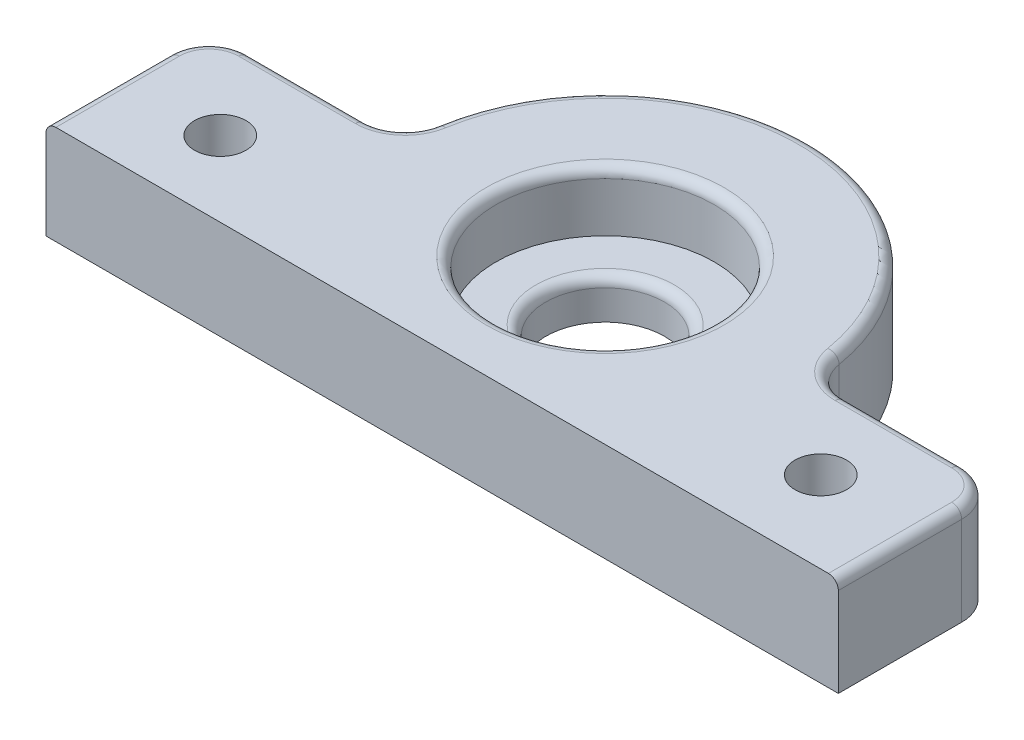
ISO-10303-21;
HEADER;
FILE_DESCRIPTION(('STEP AP214'),'2;1');
FILE_NAME('part.step','',(''),(''),'','','');
FILE_SCHEMA(('AUTOMOTIVE_DESIGN { 1 0 10303 214 1 1 1 1 }'));
ENDSEC;
DATA;
#1=APPLICATION_CONTEXT('core data for automotive mechanical design processes');
#2=APPLICATION_PROTOCOL_DEFINITION('international standard','automotive_design',2000,#1);
#3=PRODUCT_CONTEXT('',#1,'mechanical');
#4=PRODUCT('Part','Part','',(#3));
#5=PRODUCT_RELATED_PRODUCT_CATEGORY('part','',(#4));
#6=PRODUCT_DEFINITION_FORMATION('','',#4);
#7=PRODUCT_DEFINITION_CONTEXT('part definition',#1,'design');
#8=PRODUCT_DEFINITION('design','',#6,#7);
#9=PRODUCT_DEFINITION_SHAPE('','',#8);
#10=(LENGTH_UNIT() NAMED_UNIT(*) SI_UNIT(.MILLI.,.METRE.));
#11=(NAMED_UNIT(*) PLANE_ANGLE_UNIT() SI_UNIT($,.RADIAN.));
#12=(NAMED_UNIT(*) SI_UNIT($,.STERADIAN.) SOLID_ANGLE_UNIT());
#13=UNCERTAINTY_MEASURE_WITH_UNIT(LENGTH_MEASURE(1.E-05),#10,'distance_accuracy_value','');
#14=(GEOMETRIC_REPRESENTATION_CONTEXT(3) GLOBAL_UNCERTAINTY_ASSIGNED_CONTEXT((#13)) GLOBAL_UNIT_ASSIGNED_CONTEXT((#10,
#11,#12)) REPRESENTATION_CONTEXT('',''));
#15=CARTESIAN_POINT('',(0.,0.,0.));
#16=DIRECTION('',(0.,0.,1.));
#17=DIRECTION('',(1.,0.,0.));
#18=AXIS2_PLACEMENT_3D('',#15,#16,#17);
#19=CARTESIAN_POINT('',(0.,10.,0.));
#20=DIRECTION('',(0.,-1.,0.));
#21=DIRECTION('',(0.,0.,-1.));
#22=AXIS2_PLACEMENT_3D('',#19,#20,#21);
#23=CYLINDRICAL_SURFACE('',#22,11.025);
#24=CARTESIAN_POINT('',(0.,9.,0.));
#25=DIRECTION('',(0.,1.,0.));
#26=DIRECTION('',(0.,0.,1.));
#27=AXIS2_PLACEMENT_3D('',#24,#25,#26);
#28=CIRCLE('',#27,11.025);
#29=CARTESIAN_POINT('',(0.,9.,11.025));
#30=VERTEX_POINT('',#29);
#31=EDGE_CURVE('E247',#30,#30,#28,.T.);
#32=ORIENTED_EDGE('',*,*,#31,.T.);
#33=EDGE_LOOP('',(#32));
#34=FACE_BOUND('',#33,.T.);
#35=CARTESIAN_POINT('',(0.,4.,0.));
#36=DIRECTION('',(0.,-1.,0.));
#37=DIRECTION('',(0.,0.,-1.));
#38=AXIS2_PLACEMENT_3D('',#35,#36,#37);
#39=CIRCLE('',#38,11.025);
#40=CARTESIAN_POINT('',(0.,4.,-11.025));
#41=VERTEX_POINT('',#40);
#42=EDGE_CURVE('E160',#41,#41,#39,.T.);
#43=ORIENTED_EDGE('',*,*,#42,.T.);
#44=EDGE_LOOP('',(#43));
#45=FACE_BOUND('',#44,.T.);
#46=ADVANCED_FACE('F34',(#34,#45),#23,.F.);
#47=CARTESIAN_POINT('',(0.,10.,0.));
#48=DIRECTION('',(0.,1.,0.));
#49=DIRECTION('',(0.,0.,1.));
#50=AXIS2_PLACEMENT_3D('',#47,#48,#49);
#51=PLANE('',#50);
#52=CARTESIAN_POINT('',(-29.9966400739153,10.,8.86202444078227));
#53=DIRECTION('',(0.,1.,0.));
#54=DIRECTION('',(0.,0.,1.));
#55=AXIS2_PLACEMENT_3D('',#52,#53,#54);
#56=CIRCLE('',#55,2.6);
#57=CARTESIAN_POINT('',(-29.9966400739153,10.,11.4620244407823));
#58=VERTEX_POINT('',#57);
#59=EDGE_CURVE('E603',#58,#58,#56,.F.);
#60=ORIENTED_EDGE('',*,*,#59,.T.);
#61=EDGE_LOOP('',(#60));
#62=FACE_BOUND('',#61,.T.);
#63=CARTESIAN_POINT('',(30.,10.,8.22706));
#64=DIRECTION('',(0.,1.,0.));
#65=DIRECTION('',(0.,0.,1.));
#66=AXIS2_PLACEMENT_3D('',#63,#64,#65);
#67=CIRCLE('',#66,2.6);
#68=CARTESIAN_POINT('',(30.,10.,10.82706));
#69=VERTEX_POINT('',#68);
#70=EDGE_CURVE('E290',#69,#69,#67,.F.);
#71=ORIENTED_EDGE('',*,*,#70,.T.);
#72=EDGE_LOOP('',(#71));
#73=FACE_BOUND('',#72,.T.);
#74=CARTESIAN_POINT('',(0.,10.,0.));
#75=DIRECTION('',(0.,1.,0.));
#76=DIRECTION('',(0.,0.,1.));
#77=AXIS2_PLACEMENT_3D('',#74,#75,#76);
#78=CIRCLE('',#77,12.025);
#79=CARTESIAN_POINT('',(0.,10.,12.025));
#80=VERTEX_POINT('',#79);
#81=EDGE_CURVE('E226',#80,#80,#78,.F.);
#82=ORIENTED_EDGE('',*,*,#81,.T.);
#83=EDGE_LOOP('',(#82));
#84=FACE_BOUND('',#83,.T.);
#85=DIRECTION('',(1.,0.,0.));
#86=VECTOR('',#85,1.);
#87=CARTESIAN_POINT('',(-40.,10.,16.45412));
#88=LINE('',#87,#86);
#89=CARTESIAN_POINT('',(-39.,10.,16.45412));
#90=VERTEX_POINT('',#89);
#91=CARTESIAN_POINT('',(39.,10.,16.45412));
#92=VERTEX_POINT('',#91);
#93=EDGE_CURVE('E179',#90,#92,#88,.T.);
#94=ORIENTED_EDGE('',*,*,#93,.T.);
#95=DIRECTION('',(0.,0.,-1.));
#96=VECTOR('',#95,1.);
#97=CARTESIAN_POINT('',(39.,10.,4.));
#98=LINE('',#97,#96);
#99=CARTESIAN_POINT('',(39.,10.,4.));
#100=VERTEX_POINT('',#99);
#101=EDGE_CURVE('E223',#92,#100,#98,.T.);
#102=ORIENTED_EDGE('',*,*,#101,.T.);
#103=CARTESIAN_POINT('',(36.,10.,4.));
#104=DIRECTION('',(0.,1.,0.));
#105=DIRECTION('',(0.,0.,1.));
#106=AXIS2_PLACEMENT_3D('',#103,#104,#105);
#107=CIRCLE('',#106,3.);
#108=CARTESIAN_POINT('',(36.,10.,1.));
#109=VERTEX_POINT('',#108);
#110=EDGE_CURVE('E221',#100,#109,#107,.T.);
#111=ORIENTED_EDGE('',*,*,#110,.T.);
#112=DIRECTION('',(-1.,0.,0.));
#113=VECTOR('',#112,1.);
#114=CARTESIAN_POINT('',(24.2219425315147,10.,1.));
#115=LINE('',#114,#113);
#116=CARTESIAN_POINT('',(24.2219425315147,10.,1.));
#117=VERTEX_POINT('',#116);
#118=EDGE_CURVE('E219',#109,#117,#115,.T.);
#119=ORIENTED_EDGE('',*,*,#118,.T.);
#120=CARTESIAN_POINT('',(24.2219425315147,10.,-4.));
#121=DIRECTION('',(0.,1.,0.));
#122=DIRECTION('',(0.,0.,1.));
#123=AXIS2_PLACEMENT_3D('',#120,#121,#122);
#124=CIRCLE('',#123,5.);
#125=CARTESIAN_POINT('',(19.2887566798824,10.,-3.18533604887984));
#126=VERTEX_POINT('',#125);
#127=EDGE_CURVE('E217',#117,#126,#124,.F.);
#128=ORIENTED_EDGE('',*,*,#127,.T.);
#129=CARTESIAN_POINT('',(0.,10.,0.));
#130=DIRECTION('',(0.,1.,0.));
#131=DIRECTION('',(0.,0.,1.));
#132=AXIS2_PLACEMENT_3D('',#129,#130,#131);
#133=CIRCLE('',#132,19.55);
#134=CARTESIAN_POINT('',(-19.2887566798824,10.,-3.18533604887984));
#135=VERTEX_POINT('',#134);
#136=EDGE_CURVE('E215',#126,#135,#133,.T.);
#137=ORIENTED_EDGE('',*,*,#136,.T.);
#138=CARTESIAN_POINT('',(-24.2219425315147,10.,-4.));
#139=DIRECTION('',(0.,1.,0.));
#140=DIRECTION('',(0.,0.,1.));
#141=AXIS2_PLACEMENT_3D('',#138,#139,#140);
#142=CIRCLE('',#141,5.);
#143=CARTESIAN_POINT('',(-24.2219425315147,10.,1.));
#144=VERTEX_POINT('',#143);
#145=EDGE_CURVE('E213',#135,#144,#142,.F.);
#146=ORIENTED_EDGE('',*,*,#145,.T.);
#147=DIRECTION('',(-1.,0.,0.));
#148=VECTOR('',#147,1.);
#149=CARTESIAN_POINT('',(-36.,10.,1.));
#150=LINE('',#149,#148);
#151=CARTESIAN_POINT('',(-36.,10.,1.));
#152=VERTEX_POINT('',#151);
#153=EDGE_CURVE('E211',#144,#152,#150,.T.);
#154=ORIENTED_EDGE('',*,*,#153,.T.);
#155=CARTESIAN_POINT('',(-36.,10.,4.));
#156=DIRECTION('',(0.,1.,0.));
#157=DIRECTION('',(0.,0.,1.));
#158=AXIS2_PLACEMENT_3D('',#155,#156,#157);
#159=CIRCLE('',#158,3.);
#160=CARTESIAN_POINT('',(-39.,10.,4.));
#161=VERTEX_POINT('',#160);
#162=EDGE_CURVE('E209',#152,#161,#159,.T.);
#163=ORIENTED_EDGE('',*,*,#162,.T.);
#164=DIRECTION('',(0.,0.,1.));
#165=VECTOR('',#164,1.);
#166=CARTESIAN_POINT('',(-39.,10.,16.45412));
#167=LINE('',#166,#165);
#168=EDGE_CURVE('E207',#161,#90,#167,.T.);
#169=ORIENTED_EDGE('',*,*,#168,.T.);
#170=EDGE_LOOP('',(#94,#102,#111,#119,#128,#137,#146,#154,#163,#169));
#171=FACE_BOUND('',#170,.T.);
#172=ADVANCED_FACE('F295',(#62,#73,#84,#171),#51,.T.);
#173=CARTESIAN_POINT('',(0.,0.,0.));
#174=DIRECTION('',(0.,1.,0.));
#175=DIRECTION('',(0.,0.,1.));
#176=AXIS2_PLACEMENT_3D('',#173,#174,#175);
#177=PLANE('',#176);
#178=CARTESIAN_POINT('',(-29.9966400739153,0.,8.86202444078227));
#179=DIRECTION('',(0.,-1.,0.));
#180=DIRECTION('',(0.,0.,-1.));
#181=AXIS2_PLACEMENT_3D('',#178,#179,#180);
#182=CIRCLE('',#181,2.6);
#183=CARTESIAN_POINT('',(-29.9966400739153,0.,6.26202444078227));
#184=VERTEX_POINT('',#183);
#185=EDGE_CURVE('E606',#184,#184,#182,.T.);
#186=ORIENTED_EDGE('',*,*,#185,.F.);
#187=EDGE_LOOP('',(#186));
#188=FACE_BOUND('',#187,.T.);
#189=CARTESIAN_POINT('',(30.,0.,8.22706));
#190=DIRECTION('',(0.,-1.,0.));
#191=DIRECTION('',(0.,0.,-1.));
#192=AXIS2_PLACEMENT_3D('',#189,#190,#191);
#193=CIRCLE('',#192,2.6);
#194=CARTESIAN_POINT('',(30.,0.,5.62706));
#195=VERTEX_POINT('',#194);
#196=EDGE_CURVE('E258',#195,#195,#193,.T.);
#197=ORIENTED_EDGE('',*,*,#196,.F.);
#198=EDGE_LOOP('',(#197));
#199=FACE_BOUND('',#198,.T.);
#200=DIRECTION('',(0.,0.,1.));
#201=VECTOR('',#200,1.);
#202=CARTESIAN_POINT('',(-40.,0.,16.45412));
#203=LINE('',#202,#201);
#204=CARTESIAN_POINT('',(-40.,0.,4.));
#205=VERTEX_POINT('',#204);
#206=CARTESIAN_POINT('',(-40.,0.,16.45412));
#207=VERTEX_POINT('',#206);
#208=EDGE_CURVE('E156',#205,#207,#203,.T.);
#209=ORIENTED_EDGE('',*,*,#208,.F.);
#210=CARTESIAN_POINT('',(-36.,0.,4.));
#211=DIRECTION('',(0.,1.,0.));
#212=DIRECTION('',(0.,0.,1.));
#213=AXIS2_PLACEMENT_3D('',#210,#211,#212);
#214=CIRCLE('',#213,4.);
#215=CARTESIAN_POINT('',(-36.,0.,0.));
#216=VERTEX_POINT('',#215);
#217=EDGE_CURVE('E184',#205,#216,#214,.F.);
#218=ORIENTED_EDGE('',*,*,#217,.T.);
#219=DIRECTION('',(-1.,0.,0.));
#220=VECTOR('',#219,1.);
#221=CARTESIAN_POINT('',(-40.,0.,0.));
#222=LINE('',#221,#220);
#223=CARTESIAN_POINT('',(-24.2219425315147,0.,0.));
#224=VERTEX_POINT('',#223);
#225=EDGE_CURVE('E176',#224,#216,#222,.T.);
#226=ORIENTED_EDGE('',*,*,#225,.F.);
#227=CARTESIAN_POINT('',(-24.2219425315147,0.,-4.));
#228=DIRECTION('',(0.,1.,0.));
#229=DIRECTION('',(0.,0.,1.));
#230=AXIS2_PLACEMENT_3D('',#227,#228,#229);
#231=CIRCLE('',#230,4.);
#232=CARTESIAN_POINT('',(-20.2753938502088,0.,-3.34826883910387));
#233=VERTEX_POINT('',#232);
#234=EDGE_CURVE('E203',#224,#233,#231,.T.);
#235=ORIENTED_EDGE('',*,*,#234,.T.);
#236=CARTESIAN_POINT('',(0.,0.,0.));
#237=DIRECTION('',(0.,1.,0.));
#238=DIRECTION('',(0.,0.,1.));
#239=AXIS2_PLACEMENT_3D('',#236,#237,#238);
#240=CIRCLE('',#239,20.55);
#241=CARTESIAN_POINT('',(20.2753938502088,0.,-3.34826883910387));
#242=VERTEX_POINT('',#241);
#243=EDGE_CURVE('E173',#242,#233,#240,.T.);
#244=ORIENTED_EDGE('',*,*,#243,.F.);
#245=CARTESIAN_POINT('',(24.2219425315147,0.,-4.));
#246=DIRECTION('',(0.,1.,0.));
#247=DIRECTION('',(0.,0.,1.));
#248=AXIS2_PLACEMENT_3D('',#245,#246,#247);
#249=CIRCLE('',#248,4.);
#250=CARTESIAN_POINT('',(24.2219425315147,0.,0.));
#251=VERTEX_POINT('',#250);
#252=EDGE_CURVE('E205',#242,#251,#249,.T.);
#253=ORIENTED_EDGE('',*,*,#252,.T.);
#254=DIRECTION('',(-1.,0.,0.));
#255=VECTOR('',#254,1.);
#256=CARTESIAN_POINT('',(40.,0.,0.));
#257=LINE('',#256,#255);
#258=CARTESIAN_POINT('',(36.,0.,0.));
#259=VERTEX_POINT('',#258);
#260=EDGE_CURVE('E167',#259,#251,#257,.T.);
#261=ORIENTED_EDGE('',*,*,#260,.F.);
#262=CARTESIAN_POINT('',(36.,0.,4.));
#263=DIRECTION('',(0.,1.,0.));
#264=DIRECTION('',(0.,0.,1.));
#265=AXIS2_PLACEMENT_3D('',#262,#263,#264);
#266=CIRCLE('',#265,4.);
#267=CARTESIAN_POINT('',(40.,0.,4.));
#268=VERTEX_POINT('',#267);
#269=EDGE_CURVE('E182',#259,#268,#266,.F.);
#270=ORIENTED_EDGE('',*,*,#269,.T.);
#271=DIRECTION('',(0.,0.,-1.));
#272=VECTOR('',#271,1.);
#273=CARTESIAN_POINT('',(40.,0.,16.45412));
#274=LINE('',#273,#272);
#275=CARTESIAN_POINT('',(40.,0.,16.45412));
#276=VERTEX_POINT('',#275);
#277=EDGE_CURVE('E165',#276,#268,#274,.T.);
#278=ORIENTED_EDGE('',*,*,#277,.F.);
#279=DIRECTION('',(1.,0.,0.));
#280=VECTOR('',#279,1.);
#281=CARTESIAN_POINT('',(-40.,0.,16.45412));
#282=LINE('',#281,#280);
#283=EDGE_CURVE('E147',#207,#276,#282,.T.);
#284=ORIENTED_EDGE('',*,*,#283,.F.);
#285=EDGE_LOOP('',(#209,#218,#226,#235,#244,#253,#261,#270,#278,#284));
#286=FACE_BOUND('',#285,.T.);
#287=CARTESIAN_POINT('',(0.,0.,0.));
#288=DIRECTION('',(0.,-1.,0.));
#289=DIRECTION('',(0.,0.,-1.));
#290=AXIS2_PLACEMENT_3D('',#287,#288,#289);
#291=CIRCLE('',#290,6.);
#292=CARTESIAN_POINT('',(0.,0.,-6.));
#293=VERTEX_POINT('',#292);
#294=EDGE_CURVE('E279',#293,#293,#291,.T.);
#295=ORIENTED_EDGE('',*,*,#294,.F.);
#296=EDGE_LOOP('',(#295));
#297=FACE_BOUND('',#296,.T.);
#298=ADVANCED_FACE('F162',(#188,#199,#286,#297),#177,.F.);
#299=CARTESIAN_POINT('',(-40.,10.,16.45412));
#300=DIRECTION('',(1.,0.,0.));
#301=DIRECTION('',(0.,0.,-1.));
#302=AXIS2_PLACEMENT_3D('',#299,#300,#301);
#303=PLANE('',#302);
#304=DIRECTION('',(0.,-1.,0.));
#305=VECTOR('',#304,1.);
#306=CARTESIAN_POINT('',(-40.,10.,16.45412));
#307=LINE('',#306,#305);
#308=CARTESIAN_POINT('',(-40.,9.,16.45412));
#309=VERTEX_POINT('',#308);
#310=EDGE_CURVE('E142',#309,#207,#307,.T.);
#311=ORIENTED_EDGE('',*,*,#310,.F.);
#312=DIRECTION('',(0.,0.,1.));
#313=VECTOR('',#312,1.);
#314=CARTESIAN_POINT('',(-40.,9.,4.));
#315=LINE('',#314,#313);
#316=CARTESIAN_POINT('',(-40.,9.,4.));
#317=VERTEX_POINT('',#316);
#318=EDGE_CURVE('E11',#309,#317,#315,.F.);
#319=ORIENTED_EDGE('',*,*,#318,.T.);
#320=DIRECTION('',(0.,-1.,0.));
#321=VECTOR('',#320,1.);
#322=CARTESIAN_POINT('',(-40.,10.,4.));
#323=LINE('',#322,#321);
#324=EDGE_CURVE('E152',#317,#205,#323,.T.);
#325=ORIENTED_EDGE('',*,*,#324,.T.);
#326=ORIENTED_EDGE('',*,*,#208,.T.);
#327=EDGE_LOOP('',(#311,#319,#325,#326));
#328=FACE_BOUND('',#327,.T.);
#329=ADVANCED_FACE('F157',(#328),#303,.F.);
#330=CARTESIAN_POINT('',(-40.,10.,16.45412));
#331=DIRECTION('',(0.,0.,-1.));
#332=DIRECTION('',(-1.,0.,0.));
#333=AXIS2_PLACEMENT_3D('',#330,#331,#332);
#334=PLANE('',#333);
#335=DIRECTION('',(0.,-1.,0.));
#336=VECTOR('',#335,1.);
#337=CARTESIAN_POINT('',(40.,10.,16.45412));
#338=LINE('',#337,#336);
#339=CARTESIAN_POINT('',(40.,9.,16.45412));
#340=VERTEX_POINT('',#339);
#341=EDGE_CURVE('E153',#340,#276,#338,.T.);
#342=ORIENTED_EDGE('',*,*,#341,.F.);
#343=CARTESIAN_POINT('',(39.,9.,16.45412));
#344=DIRECTION('',(0.,0.,-1.));
#345=DIRECTION('',(-1.,0.,0.));
#346=AXIS2_PLACEMENT_3D('',#343,#344,#345);
#347=CIRCLE('',#346,1.);
#348=EDGE_CURVE('E232',#340,#92,#347,.F.);
#349=ORIENTED_EDGE('',*,*,#348,.T.);
#350=ORIENTED_EDGE('',*,*,#93,.F.);
#351=CARTESIAN_POINT('',(-39.,9.,16.45412));
#352=DIRECTION('',(0.,0.,-1.));
#353=DIRECTION('',(-1.,0.,0.));
#354=AXIS2_PLACEMENT_3D('',#351,#352,#353);
#355=CIRCLE('',#354,1.);
#356=EDGE_CURVE('E151',#90,#309,#355,.F.);
#357=ORIENTED_EDGE('',*,*,#356,.T.);
#358=ORIENTED_EDGE('',*,*,#310,.T.);
#359=ORIENTED_EDGE('',*,*,#283,.T.);
#360=EDGE_LOOP('',(#342,#349,#350,#357,#358,#359));
#361=FACE_BOUND('',#360,.T.);
#362=ADVANCED_FACE('F145',(#361),#334,.F.);
#363=CARTESIAN_POINT('',(40.,10.,16.45412));
#364=DIRECTION('',(-1.,0.,0.));
#365=DIRECTION('',(0.,0.,1.));
#366=AXIS2_PLACEMENT_3D('',#363,#364,#365);
#367=PLANE('',#366);
#368=DIRECTION('',(0.,-1.,0.));
#369=VECTOR('',#368,1.);
#370=CARTESIAN_POINT('',(40.,10.,4.));
#371=LINE('',#370,#369);
#372=CARTESIAN_POINT('',(40.,9.,4.));
#373=VERTEX_POINT('',#372);
#374=EDGE_CURVE('E200',#268,#373,#371,.F.);
#375=ORIENTED_EDGE('',*,*,#374,.T.);
#376=DIRECTION('',(0.,0.,-1.));
#377=VECTOR('',#376,1.);
#378=CARTESIAN_POINT('',(40.,9.,16.45412));
#379=LINE('',#378,#377);
#380=EDGE_CURVE('E229',#373,#340,#379,.F.);
#381=ORIENTED_EDGE('',*,*,#380,.T.);
#382=ORIENTED_EDGE('',*,*,#341,.T.);
#383=ORIENTED_EDGE('',*,*,#277,.T.);
#384=EDGE_LOOP('',(#375,#381,#382,#383));
#385=FACE_BOUND('',#384,.T.);
#386=ADVANCED_FACE('F375',(#385),#367,.F.);
#387=CARTESIAN_POINT('',(40.,10.,0.));
#388=DIRECTION('',(0.,0.,1.));
#389=DIRECTION('',(1.,0.,0.));
#390=AXIS2_PLACEMENT_3D('',#387,#388,#389);
#391=PLANE('',#390);
#392=DIRECTION('',(0.,1.,0.));
#393=VECTOR('',#392,1.);
#394=CARTESIAN_POINT('',(24.2219425315147,10.,0.));
#395=LINE('',#394,#393);
#396=CARTESIAN_POINT('',(24.2219425315147,9.,0.));
#397=VERTEX_POINT('',#396);
#398=EDGE_CURVE('E197',#251,#397,#395,.T.);
#399=ORIENTED_EDGE('',*,*,#398,.T.);
#400=DIRECTION('',(-1.,0.,0.));
#401=VECTOR('',#400,1.);
#402=CARTESIAN_POINT('',(36.,9.,0.));
#403=LINE('',#402,#401);
#404=CARTESIAN_POINT('',(36.,9.,0.));
#405=VERTEX_POINT('',#404);
#406=EDGE_CURVE('E236',#397,#405,#403,.F.);
#407=ORIENTED_EDGE('',*,*,#406,.T.);
#408=DIRECTION('',(0.,-1.,0.));
#409=VECTOR('',#408,1.);
#410=CARTESIAN_POINT('',(36.,10.,0.));
#411=LINE('',#410,#409);
#412=EDGE_CURVE('E195',#405,#259,#411,.T.);
#413=ORIENTED_EDGE('',*,*,#412,.T.);
#414=ORIENTED_EDGE('',*,*,#260,.T.);
#415=EDGE_LOOP('',(#399,#407,#413,#414));
#416=FACE_BOUND('',#415,.T.);
#417=ADVANCED_FACE('F371',(#416),#391,.F.);
#418=CARTESIAN_POINT('',(0.,10.,0.));
#419=DIRECTION('',(0.,-1.,0.));
#420=DIRECTION('',(0.,0.,-1.));
#421=AXIS2_PLACEMENT_3D('',#418,#419,#420);
#422=CYLINDRICAL_SURFACE('',#421,20.55);
#423=DIRECTION('',(0.,-1.,0.));
#424=VECTOR('',#423,1.);
#425=CARTESIAN_POINT('',(-20.2753938502088,10.,-3.34826883910387));
#426=LINE('',#425,#424);
#427=CARTESIAN_POINT('',(-20.2753938502088,9.,-3.34826883910387));
#428=VERTEX_POINT('',#427);
#429=EDGE_CURVE('E192',#233,#428,#426,.F.);
#430=ORIENTED_EDGE('',*,*,#429,.T.);
#431=CARTESIAN_POINT('',(0.,9.,0.));
#432=DIRECTION('',(0.,1.,0.));
#433=DIRECTION('',(0.,0.,1.));
#434=AXIS2_PLACEMENT_3D('',#431,#432,#433);
#435=CIRCLE('',#434,20.55);
#436=CARTESIAN_POINT('',(20.2753938502088,9.,-3.34826883910387));
#437=VERTEX_POINT('',#436);
#438=EDGE_CURVE('E240',#428,#437,#435,.F.);
#439=ORIENTED_EDGE('',*,*,#438,.T.);
#440=DIRECTION('',(0.,-1.,0.));
#441=VECTOR('',#440,1.);
#442=CARTESIAN_POINT('',(20.2753938502088,10.,-3.34826883910387));
#443=LINE('',#442,#441);
#444=EDGE_CURVE('E190',#437,#242,#443,.T.);
#445=ORIENTED_EDGE('',*,*,#444,.T.);
#446=ORIENTED_EDGE('',*,*,#243,.T.);
#447=EDGE_LOOP('',(#430,#439,#445,#446));
#448=FACE_BOUND('',#447,.T.);
#449=ADVANCED_FACE('F368',(#448),#422,.T.);
#450=CARTESIAN_POINT('',(-40.,10.,0.));
#451=DIRECTION('',(0.,0.,1.));
#452=DIRECTION('',(1.,0.,0.));
#453=AXIS2_PLACEMENT_3D('',#450,#451,#452);
#454=PLANE('',#453);
#455=DIRECTION('',(0.,-1.,0.));
#456=VECTOR('',#455,1.);
#457=CARTESIAN_POINT('',(-36.,10.,0.));
#458=LINE('',#457,#456);
#459=CARTESIAN_POINT('',(-36.,9.,0.));
#460=VERTEX_POINT('',#459);
#461=EDGE_CURVE('E188',#216,#460,#458,.F.);
#462=ORIENTED_EDGE('',*,*,#461,.T.);
#463=DIRECTION('',(-1.,0.,0.));
#464=VECTOR('',#463,1.);
#465=CARTESIAN_POINT('',(-24.2219425315147,9.,0.));
#466=LINE('',#465,#464);
#467=CARTESIAN_POINT('',(-24.2219425315147,9.,0.));
#468=VERTEX_POINT('',#467);
#469=EDGE_CURVE('E244',#460,#468,#466,.F.);
#470=ORIENTED_EDGE('',*,*,#469,.T.);
#471=DIRECTION('',(0.,1.,0.));
#472=VECTOR('',#471,1.);
#473=CARTESIAN_POINT('',(-24.2219425315147,0.,0.));
#474=LINE('',#473,#472);
#475=EDGE_CURVE('E186',#468,#224,#474,.F.);
#476=ORIENTED_EDGE('',*,*,#475,.T.);
#477=ORIENTED_EDGE('',*,*,#225,.T.);
#478=EDGE_LOOP('',(#462,#470,#476,#477));
#479=FACE_BOUND('',#478,.T.);
#480=ADVANCED_FACE('F330',(#479),#454,.F.);
#481=CARTESIAN_POINT('',(0.,4.,0.));
#482=DIRECTION('',(0.,-1.,0.));
#483=DIRECTION('',(0.,0.,-1.));
#484=AXIS2_PLACEMENT_3D('',#481,#482,#483);
#485=PLANE('',#484);
#486=CARTESIAN_POINT('',(0.,4.,0.));
#487=DIRECTION('',(0.,-1.,0.));
#488=DIRECTION('',(0.,0.,-1.));
#489=AXIS2_PLACEMENT_3D('',#486,#487,#488);
#490=CIRCLE('',#489,7.);
#491=CARTESIAN_POINT('',(0.,4.,-7.));
#492=VERTEX_POINT('',#491);
#493=EDGE_CURVE('E250',#492,#492,#490,.T.);
#494=ORIENTED_EDGE('',*,*,#493,.T.);
#495=EDGE_LOOP('',(#494));
#496=FACE_BOUND('',#495,.T.);
#497=ORIENTED_EDGE('',*,*,#42,.F.);
#498=EDGE_LOOP('',(#497));
#499=FACE_BOUND('',#498,.T.);
#500=ADVANCED_FACE('F360',(#496,#499),#485,.F.);
#501=CARTESIAN_POINT('',(0.,4.,0.));
#502=DIRECTION('',(0.,-1.,0.));
#503=DIRECTION('',(0.,0.,-1.));
#504=AXIS2_PLACEMENT_3D('',#501,#502,#503);
#505=CYLINDRICAL_SURFACE('',#504,6.);
#506=CARTESIAN_POINT('',(0.,3.,0.));
#507=DIRECTION('',(0.,-1.,0.));
#508=DIRECTION('',(0.,0.,-1.));
#509=AXIS2_PLACEMENT_3D('',#506,#507,#508);
#510=CIRCLE('',#509,6.);
#511=CARTESIAN_POINT('',(0.,3.,-6.));
#512=VERTEX_POINT('',#511);
#513=EDGE_CURVE('E43',#512,#512,#510,.F.);
#514=ORIENTED_EDGE('',*,*,#513,.T.);
#515=EDGE_LOOP('',(#514));
#516=FACE_BOUND('',#515,.T.);
#517=ORIENTED_EDGE('',*,*,#294,.T.);
#518=EDGE_LOOP('',(#517));
#519=FACE_BOUND('',#518,.T.);
#520=ADVANCED_FACE('F386',(#516,#519),#505,.F.);
#521=CARTESIAN_POINT('',(-36.,10.,4.));
#522=DIRECTION('',(0.,-1.,0.));
#523=DIRECTION('',(0.,0.,-1.));
#524=AXIS2_PLACEMENT_3D('',#521,#522,#523);
#525=CYLINDRICAL_SURFACE('',#524,4.);
#526=ORIENTED_EDGE('',*,*,#324,.F.);
#527=CARTESIAN_POINT('',(-36.,9.,4.));
#528=DIRECTION('',(0.,1.,0.));
#529=DIRECTION('',(0.,0.,1.));
#530=AXIS2_PLACEMENT_3D('',#527,#528,#529);
#531=CIRCLE('',#530,4.);
#532=EDGE_CURVE('E56',#317,#460,#531,.F.);
#533=ORIENTED_EDGE('',*,*,#532,.T.);
#534=ORIENTED_EDGE('',*,*,#461,.F.);
#535=ORIENTED_EDGE('',*,*,#217,.F.);
#536=EDGE_LOOP('',(#526,#533,#534,#535));
#537=FACE_BOUND('',#536,.T.);
#538=ADVANCED_FACE('F337',(#537),#525,.T.);
#539=CARTESIAN_POINT('',(-24.2219425315147,10.,-4.));
#540=DIRECTION('',(0.,-1.,0.));
#541=DIRECTION('',(0.,0.,-1.));
#542=AXIS2_PLACEMENT_3D('',#539,#540,#541);
#543=CYLINDRICAL_SURFACE('',#542,4.);
#544=ORIENTED_EDGE('',*,*,#475,.F.);
#545=CARTESIAN_POINT('',(-24.2219425315147,9.,-4.));
#546=DIRECTION('',(0.,1.,0.));
#547=DIRECTION('',(0.,0.,1.));
#548=AXIS2_PLACEMENT_3D('',#545,#546,#547);
#549=CIRCLE('',#548,4.);
#550=EDGE_CURVE('E242',#468,#428,#549,.T.);
#551=ORIENTED_EDGE('',*,*,#550,.T.);
#552=ORIENTED_EDGE('',*,*,#429,.F.);
#553=ORIENTED_EDGE('',*,*,#234,.F.);
#554=EDGE_LOOP('',(#544,#551,#552,#553));
#555=FACE_BOUND('',#554,.T.);
#556=ADVANCED_FACE('F333',(#555),#543,.F.);
#557=CARTESIAN_POINT('',(24.2219425315147,10.,-4.));
#558=DIRECTION('',(0.,-1.,0.));
#559=DIRECTION('',(0.,0.,-1.));
#560=AXIS2_PLACEMENT_3D('',#557,#558,#559);
#561=CYLINDRICAL_SURFACE('',#560,4.);
#562=ORIENTED_EDGE('',*,*,#444,.F.);
#563=CARTESIAN_POINT('',(24.2219425315147,9.,-4.));
#564=DIRECTION('',(0.,1.,0.));
#565=DIRECTION('',(0.,0.,1.));
#566=AXIS2_PLACEMENT_3D('',#563,#564,#565);
#567=CIRCLE('',#566,4.);
#568=EDGE_CURVE('E238',#437,#397,#567,.T.);
#569=ORIENTED_EDGE('',*,*,#568,.T.);
#570=ORIENTED_EDGE('',*,*,#398,.F.);
#571=ORIENTED_EDGE('',*,*,#252,.F.);
#572=EDGE_LOOP('',(#562,#569,#570,#571));
#573=FACE_BOUND('',#572,.T.);
#574=ADVANCED_FACE('F389',(#573),#561,.F.);
#575=CARTESIAN_POINT('',(36.,10.,4.));
#576=DIRECTION('',(0.,-1.,0.));
#577=DIRECTION('',(0.,0.,-1.));
#578=AXIS2_PLACEMENT_3D('',#575,#576,#577);
#579=CYLINDRICAL_SURFACE('',#578,4.);
#580=ORIENTED_EDGE('',*,*,#412,.F.);
#581=CARTESIAN_POINT('',(36.,9.,4.));
#582=DIRECTION('',(0.,1.,0.));
#583=DIRECTION('',(0.,0.,1.));
#584=AXIS2_PLACEMENT_3D('',#581,#582,#583);
#585=CIRCLE('',#584,4.);
#586=EDGE_CURVE('E234',#405,#373,#585,.F.);
#587=ORIENTED_EDGE('',*,*,#586,.T.);
#588=ORIENTED_EDGE('',*,*,#374,.F.);
#589=ORIENTED_EDGE('',*,*,#269,.F.);
#590=EDGE_LOOP('',(#580,#587,#588,#589));
#591=FACE_BOUND('',#590,.T.);
#592=ADVANCED_FACE('F348',(#591),#579,.T.);
#593=CARTESIAN_POINT('',(-39.,9.,0.));
#594=DIRECTION('',(0.,0.,-1.));
#595=DIRECTION('',(-1.,0.,0.));
#596=AXIS2_PLACEMENT_3D('',#593,#594,#595);
#597=CYLINDRICAL_SURFACE('',#596,1.);
#598=ORIENTED_EDGE('',*,*,#356,.F.);
#599=ORIENTED_EDGE('',*,*,#168,.F.);
#600=CARTESIAN_POINT('',(-39.,9.,4.));
#601=DIRECTION('',(0.,0.,-1.));
#602=DIRECTION('',(-1.,0.,0.));
#603=AXIS2_PLACEMENT_3D('',#600,#601,#602);
#604=CIRCLE('',#603,1.);
#605=EDGE_CURVE('E38',#317,#161,#604,.T.);
#606=ORIENTED_EDGE('',*,*,#605,.F.);
#607=ORIENTED_EDGE('',*,*,#318,.F.);
#608=EDGE_LOOP('',(#598,#599,#606,#607));
#609=FACE_BOUND('',#608,.T.);
#610=ADVANCED_FACE('F339',(#609),#597,.T.);
#611=CARTESIAN_POINT('',(-36.,9.,4.));
#612=DIRECTION('',(0.,1.,0.));
#613=DIRECTION('',(0.,0.,1.));
#614=AXIS2_PLACEMENT_3D('',#611,#612,#613);
#615=TOROIDAL_SURFACE('',#614,3.,1.);
#616=ORIENTED_EDGE('',*,*,#605,.T.);
#617=ORIENTED_EDGE('',*,*,#162,.F.);
#618=CARTESIAN_POINT('',(-36.,9.,1.));
#619=DIRECTION('',(1.,0.,0.));
#620=DIRECTION('',(0.,0.,-1.));
#621=AXIS2_PLACEMENT_3D('',#618,#619,#620);
#622=CIRCLE('',#621,1.);
#623=EDGE_CURVE('E272',#460,#152,#622,.T.);
#624=ORIENTED_EDGE('',*,*,#623,.F.);
#625=ORIENTED_EDGE('',*,*,#532,.F.);
#626=EDGE_LOOP('',(#616,#617,#624,#625));
#627=FACE_BOUND('',#626,.T.);
#628=ADVANCED_FACE('F340',(#627),#615,.T.);
#629=CARTESIAN_POINT('',(0.,9.,1.));
#630=DIRECTION('',(1.,0.,0.));
#631=DIRECTION('',(0.,0.,-1.));
#632=AXIS2_PLACEMENT_3D('',#629,#630,#631);
#633=CYLINDRICAL_SURFACE('',#632,1.);
#634=ORIENTED_EDGE('',*,*,#623,.T.);
#635=ORIENTED_EDGE('',*,*,#153,.F.);
#636=CARTESIAN_POINT('',(-24.2219425315147,9.,1.));
#637=DIRECTION('',(1.,0.,0.));
#638=DIRECTION('',(0.,0.,-1.));
#639=AXIS2_PLACEMENT_3D('',#636,#637,#638);
#640=CIRCLE('',#639,1.);
#641=EDGE_CURVE('E270',#468,#144,#640,.T.);
#642=ORIENTED_EDGE('',*,*,#641,.F.);
#643=ORIENTED_EDGE('',*,*,#469,.F.);
#644=EDGE_LOOP('',(#634,#635,#642,#643));
#645=FACE_BOUND('',#644,.T.);
#646=ADVANCED_FACE('F327',(#645),#633,.T.);
#647=CARTESIAN_POINT('',(-24.2219425315147,9.,-4.));
#648=DIRECTION('',(0.,1.,0.));
#649=DIRECTION('',(0.,0.,1.));
#650=AXIS2_PLACEMENT_3D('',#647,#648,#649);
#651=TOROIDAL_SURFACE('',#650,5.,1.);
#652=ORIENTED_EDGE('',*,*,#641,.T.);
#653=ORIENTED_EDGE('',*,*,#145,.F.);
#654=CARTESIAN_POINT('',(-19.2887566798824,9.,-3.18533604887984));
#655=DIRECTION('',(0.162932790224033,0.,-0.986637170326464));
#656=DIRECTION('',(-0.986637170326464,0.,-0.162932790224033));
#657=AXIS2_PLACEMENT_3D('',#654,#655,#656);
#658=CIRCLE('',#657,1.);
#659=EDGE_CURVE('E267',#428,#135,#658,.T.);
#660=ORIENTED_EDGE('',*,*,#659,.F.);
#661=ORIENTED_EDGE('',*,*,#550,.F.);
#662=EDGE_LOOP('',(#652,#653,#660,#661));
#663=FACE_BOUND('',#662,.T.);
#664=ADVANCED_FACE('F325',(#663),#651,.T.);
#665=CARTESIAN_POINT('',(0.,9.,0.));
#666=DIRECTION('',(0.,1.,0.));
#667=DIRECTION('',(0.,0.,1.));
#668=AXIS2_PLACEMENT_3D('',#665,#666,#667);
#669=TOROIDAL_SURFACE('',#668,19.55,1.);
#670=ORIENTED_EDGE('',*,*,#659,.T.);
#671=ORIENTED_EDGE('',*,*,#136,.F.);
#672=CARTESIAN_POINT('',(19.2887566798824,9.,-3.18533604887984));
#673=DIRECTION('',(0.162932790224033,0.,0.986637170326464));
#674=DIRECTION('',(0.986637170326464,0.,-0.162932790224033));
#675=AXIS2_PLACEMENT_3D('',#672,#673,#674);
#676=CIRCLE('',#675,1.);
#677=EDGE_CURVE('E264',#437,#126,#676,.T.);
#678=ORIENTED_EDGE('',*,*,#677,.F.);
#679=ORIENTED_EDGE('',*,*,#438,.F.);
#680=EDGE_LOOP('',(#670,#671,#678,#679));
#681=FACE_BOUND('',#680,.T.);
#682=ADVANCED_FACE('F320',(#681),#669,.T.);
#683=CARTESIAN_POINT('',(24.2219425315147,9.,-4.));
#684=DIRECTION('',(0.,1.,0.));
#685=DIRECTION('',(0.,0.,1.));
#686=AXIS2_PLACEMENT_3D('',#683,#684,#685);
#687=TOROIDAL_SURFACE('',#686,5.,1.);
#688=ORIENTED_EDGE('',*,*,#677,.T.);
#689=ORIENTED_EDGE('',*,*,#127,.F.);
#690=CARTESIAN_POINT('',(24.2219425315147,9.,1.));
#691=DIRECTION('',(1.,0.,0.));
#692=DIRECTION('',(0.,0.,-1.));
#693=AXIS2_PLACEMENT_3D('',#690,#691,#692);
#694=CIRCLE('',#693,1.);
#695=EDGE_CURVE('E261',#397,#117,#694,.T.);
#696=ORIENTED_EDGE('',*,*,#695,.F.);
#697=ORIENTED_EDGE('',*,*,#568,.F.);
#698=EDGE_LOOP('',(#688,#689,#696,#697));
#699=FACE_BOUND('',#698,.T.);
#700=ADVANCED_FACE('F315',(#699),#687,.T.);
#701=CARTESIAN_POINT('',(0.,9.,1.));
#702=DIRECTION('',(1.,0.,0.));
#703=DIRECTION('',(0.,0.,-1.));
#704=AXIS2_PLACEMENT_3D('',#701,#702,#703);
#705=CYLINDRICAL_SURFACE('',#704,1.);
#706=ORIENTED_EDGE('',*,*,#695,.T.);
#707=ORIENTED_EDGE('',*,*,#118,.F.);
#708=CARTESIAN_POINT('',(36.,9.,1.));
#709=DIRECTION('',(1.,0.,0.));
#710=DIRECTION('',(0.,0.,-1.));
#711=AXIS2_PLACEMENT_3D('',#708,#709,#710);
#712=CIRCLE('',#711,1.);
#713=EDGE_CURVE('E257',#405,#109,#712,.T.);
#714=ORIENTED_EDGE('',*,*,#713,.F.);
#715=ORIENTED_EDGE('',*,*,#406,.F.);
#716=EDGE_LOOP('',(#706,#707,#714,#715));
#717=FACE_BOUND('',#716,.T.);
#718=ADVANCED_FACE('F310',(#717),#705,.T.);
#719=CARTESIAN_POINT('',(36.,9.,4.));
#720=DIRECTION('',(0.,1.,0.));
#721=DIRECTION('',(0.,0.,1.));
#722=AXIS2_PLACEMENT_3D('',#719,#720,#721);
#723=TOROIDAL_SURFACE('',#722,3.,1.);
#724=ORIENTED_EDGE('',*,*,#713,.T.);
#725=ORIENTED_EDGE('',*,*,#110,.F.);
#726=CARTESIAN_POINT('',(39.,9.,4.));
#727=DIRECTION('',(0.,0.,1.));
#728=DIRECTION('',(1.,0.,0.));
#729=AXIS2_PLACEMENT_3D('',#726,#727,#728);
#730=CIRCLE('',#729,1.);
#731=EDGE_CURVE('E255',#373,#100,#730,.T.);
#732=ORIENTED_EDGE('',*,*,#731,.F.);
#733=ORIENTED_EDGE('',*,*,#586,.F.);
#734=EDGE_LOOP('',(#724,#725,#732,#733));
#735=FACE_BOUND('',#734,.T.);
#736=ADVANCED_FACE('F305',(#735),#723,.T.);
#737=CARTESIAN_POINT('',(39.,9.,0.));
#738=DIRECTION('',(0.,0.,1.));
#739=DIRECTION('',(1.,0.,0.));
#740=AXIS2_PLACEMENT_3D('',#737,#738,#739);
#741=CYLINDRICAL_SURFACE('',#740,1.);
#742=ORIENTED_EDGE('',*,*,#348,.F.);
#743=ORIENTED_EDGE('',*,*,#380,.F.);
#744=ORIENTED_EDGE('',*,*,#731,.T.);
#745=ORIENTED_EDGE('',*,*,#101,.F.);
#746=EDGE_LOOP('',(#742,#743,#744,#745));
#747=FACE_BOUND('',#746,.T.);
#748=ADVANCED_FACE('F299',(#747),#741,.T.);
#749=CARTESIAN_POINT('',(0.,9.,0.));
#750=DIRECTION('',(0.,1.,0.));
#751=DIRECTION('',(0.,0.,1.));
#752=AXIS2_PLACEMENT_3D('',#749,#750,#751);
#753=TOROIDAL_SURFACE('',#752,12.025,1.);
#754=ORIENTED_EDGE('',*,*,#81,.F.);
#755=EDGE_LOOP('',(#754));
#756=FACE_BOUND('',#755,.T.);
#757=ORIENTED_EDGE('',*,*,#31,.F.);
#758=EDGE_LOOP('',(#757));
#759=FACE_BOUND('',#758,.T.);
#760=ADVANCED_FACE('F398',(#756,#759),#753,.T.);
#761=CARTESIAN_POINT('',(0.,3.,0.));
#762=DIRECTION('',(0.,-1.,0.));
#763=DIRECTION('',(0.,0.,-1.));
#764=AXIS2_PLACEMENT_3D('',#761,#762,#763);
#765=TOROIDAL_SURFACE('',#764,7.,1.);
#766=ORIENTED_EDGE('',*,*,#513,.F.);
#767=EDGE_LOOP('',(#766));
#768=FACE_BOUND('',#767,.T.);
#769=ORIENTED_EDGE('',*,*,#493,.F.);
#770=EDGE_LOOP('',(#769));
#771=FACE_BOUND('',#770,.T.);
#772=ADVANCED_FACE('F36',(#768,#771),#765,.T.);
#773=CARTESIAN_POINT('',(30.,10.001,8.22706));
#774=DIRECTION('',(0.,-1.,0.));
#775=DIRECTION('',(0.,0.,-1.));
#776=AXIS2_PLACEMENT_3D('',#773,#774,#775);
#777=CYLINDRICAL_SURFACE('',#776,2.6);
#778=ORIENTED_EDGE('',*,*,#70,.F.);
#779=EDGE_LOOP('',(#778));
#780=FACE_BOUND('',#779,.T.);
#781=ORIENTED_EDGE('',*,*,#196,.T.);
#782=EDGE_LOOP('',(#781));
#783=FACE_BOUND('',#782,.T.);
#784=ADVANCED_FACE('F444',(#780,#783),#777,.F.);
#785=CARTESIAN_POINT('',(-29.9966400739153,10.001,8.86202444078227));
#786=DIRECTION('',(0.,-1.,0.));
#787=DIRECTION('',(0.,0.,-1.));
#788=AXIS2_PLACEMENT_3D('',#785,#786,#787);
#789=CYLINDRICAL_SURFACE('',#788,2.6);
#790=ORIENTED_EDGE('',*,*,#59,.F.);
#791=EDGE_LOOP('',(#790));
#792=FACE_BOUND('',#791,.T.);
#793=ORIENTED_EDGE('',*,*,#185,.T.);
#794=EDGE_LOOP('',(#793));
#795=FACE_BOUND('',#794,.T.);
#796=ADVANCED_FACE('F452',(#792,#795),#789,.F.);
#797=CLOSED_SHELL('',(#46,#172,#298,#329,#362,#386,#417,#449,#480,#500,#520,#538,#556,#574,#592,
#610,#628,#646,#664,#682,#700,#718,#736,#748,#760,#772,#784,#796));
#798=MANIFOLD_SOLID_BREP('B2',#797);
#799=ADVANCED_BREP_SHAPE_REPRESENTATION('',(#18,#798),#14);
#800=SHAPE_DEFINITION_REPRESENTATION(#9,#799);
ENDSEC;
END-ISO-10303-21;
